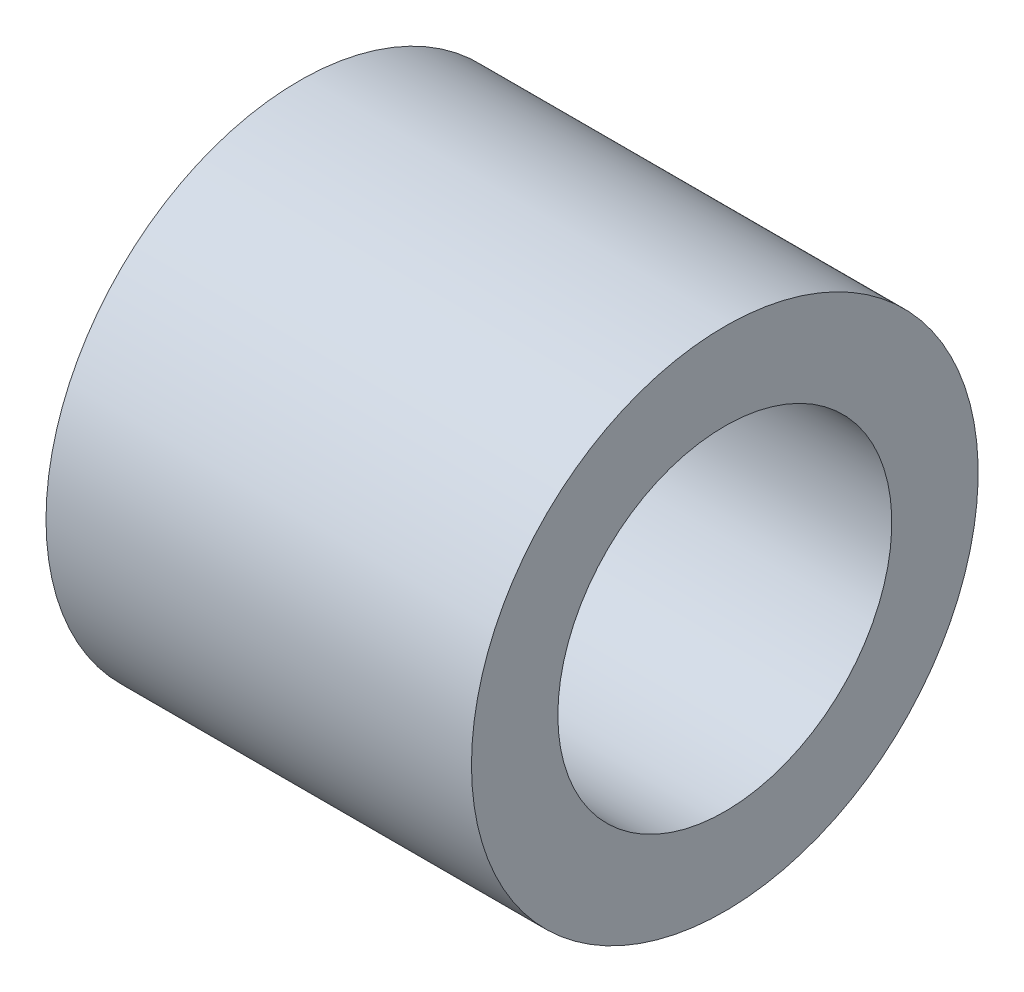
ISO-10303-21;
HEADER;
FILE_DESCRIPTION(('STEP AP214'),'2;1');
FILE_NAME('part.step','',(''),(''),'','','');
FILE_SCHEMA(('AUTOMOTIVE_DESIGN { 1 0 10303 214 1 1 1 1 }'));
ENDSEC;
DATA;
#1=APPLICATION_CONTEXT('core data for automotive mechanical design processes');
#2=APPLICATION_PROTOCOL_DEFINITION('international standard','automotive_design',2000,#1);
#3=PRODUCT_CONTEXT('',#1,'mechanical');
#4=PRODUCT('Part','Part','',(#3));
#5=PRODUCT_RELATED_PRODUCT_CATEGORY('part','',(#4));
#6=PRODUCT_DEFINITION_FORMATION('','',#4);
#7=PRODUCT_DEFINITION_CONTEXT('part definition',#1,'design');
#8=PRODUCT_DEFINITION('design','',#6,#7);
#9=PRODUCT_DEFINITION_SHAPE('','',#8);
#10=(LENGTH_UNIT() NAMED_UNIT(*) SI_UNIT(.MILLI.,.METRE.));
#11=(NAMED_UNIT(*) PLANE_ANGLE_UNIT() SI_UNIT($,.RADIAN.));
#12=(NAMED_UNIT(*) SI_UNIT($,.STERADIAN.) SOLID_ANGLE_UNIT());
#13=UNCERTAINTY_MEASURE_WITH_UNIT(LENGTH_MEASURE(1.E-05),#10,'distance_accuracy_value','');
#14=(GEOMETRIC_REPRESENTATION_CONTEXT(3) GLOBAL_UNCERTAINTY_ASSIGNED_CONTEXT((#13)) GLOBAL_UNIT_ASSIGNED_CONTEXT((#10,
#11,#12)) REPRESENTATION_CONTEXT('',''));
#15=CARTESIAN_POINT('',(0.,0.,0.));
#16=DIRECTION('',(0.,0.,1.));
#17=DIRECTION('',(1.,0.,0.));
#18=AXIS2_PLACEMENT_3D('',#15,#16,#17);
#19=CARTESIAN_POINT('',(7.1374,0.,0.));
#20=DIRECTION('',(-1.,0.,0.));
#21=DIRECTION('',(0.,0.,1.));
#22=AXIS2_PLACEMENT_3D('',#19,#20,#21);
#23=CYLINDRICAL_SURFACE('',#22,5.6019141918931);
#24=CARTESIAN_POINT('',(-7.1374,0.,0.));
#25=DIRECTION('',(-1.,0.,0.));
#26=DIRECTION('',(0.,0.,1.));
#27=AXIS2_PLACEMENT_3D('',#24,#25,#26);
#28=CIRCLE('',#27,5.6019141918931);
#29=CARTESIAN_POINT('',(-7.1374,0.,5.6019141918931));
#30=VERTEX_POINT('',#29);
#31=EDGE_CURVE('E27',#30,#30,#28,.T.);
#32=ORIENTED_EDGE('',*,*,#31,.T.);
#33=EDGE_LOOP('',(#32));
#34=FACE_BOUND('',#33,.T.);
#35=CARTESIAN_POINT('',(7.1374,0.,0.));
#36=DIRECTION('',(-1.,0.,0.));
#37=DIRECTION('',(0.,0.,1.));
#38=AXIS2_PLACEMENT_3D('',#35,#36,#37);
#39=CIRCLE('',#38,5.6019141918931);
#40=CARTESIAN_POINT('',(7.1374,0.,5.6019141918931));
#41=VERTEX_POINT('',#40);
#42=EDGE_CURVE('E18',#41,#41,#39,.T.);
#43=ORIENTED_EDGE('',*,*,#42,.F.);
#44=EDGE_LOOP('',(#43));
#45=FACE_BOUND('',#44,.T.);
#46=ADVANCED_FACE('F15',(#34,#45),#23,.F.);
#47=CARTESIAN_POINT('',(7.1374,0.,0.));
#48=DIRECTION('',(1.,0.,0.));
#49=DIRECTION('',(0.,0.,-1.));
#50=AXIS2_PLACEMENT_3D('',#47,#48,#49);
#51=PLANE('',#50);
#52=ORIENTED_EDGE('',*,*,#42,.T.);
#53=EDGE_LOOP('',(#52));
#54=FACE_BOUND('',#53,.T.);
#55=CARTESIAN_POINT('',(7.1374,0.,0.));
#56=DIRECTION('',(-1.,0.,0.));
#57=DIRECTION('',(0.,0.,1.));
#58=AXIS2_PLACEMENT_3D('',#55,#56,#57);
#59=CIRCLE('',#58,8.5);
#60=CARTESIAN_POINT('',(7.1374,0.,8.5));
#61=VERTEX_POINT('',#60);
#62=EDGE_CURVE('E22',#61,#61,#59,.T.);
#63=ORIENTED_EDGE('',*,*,#62,.F.);
#64=EDGE_LOOP('',(#63));
#65=FACE_BOUND('',#64,.T.);
#66=ADVANCED_FACE('F35',(#54,#65),#51,.T.);
#67=CARTESIAN_POINT('',(-7.1374,0.,0.));
#68=DIRECTION('',(1.,0.,0.));
#69=DIRECTION('',(0.,0.,-1.));
#70=AXIS2_PLACEMENT_3D('',#67,#68,#69);
#71=PLANE('',#70);
#72=ORIENTED_EDGE('',*,*,#31,.F.);
#73=EDGE_LOOP('',(#72));
#74=FACE_BOUND('',#73,.T.);
#75=CARTESIAN_POINT('',(-7.1374,0.,0.));
#76=DIRECTION('',(-1.,0.,0.));
#77=DIRECTION('',(0.,0.,1.));
#78=AXIS2_PLACEMENT_3D('',#75,#76,#77);
#79=CIRCLE('',#78,8.5);
#80=CARTESIAN_POINT('',(-7.1374,0.,8.5));
#81=VERTEX_POINT('',#80);
#82=EDGE_CURVE('E10',#81,#81,#79,.F.);
#83=ORIENTED_EDGE('',*,*,#82,.F.);
#84=EDGE_LOOP('',(#83));
#85=FACE_BOUND('',#84,.T.);
#86=ADVANCED_FACE('F43',(#74,#85),#71,.F.);
#87=CARTESIAN_POINT('',(7.1374,0.,0.));
#88=DIRECTION('',(-1.,0.,0.));
#89=DIRECTION('',(0.,0.,1.));
#90=AXIS2_PLACEMENT_3D('',#87,#88,#89);
#91=CYLINDRICAL_SURFACE('',#90,8.5);
#92=ORIENTED_EDGE('',*,*,#82,.T.);
#93=EDGE_LOOP('',(#92));
#94=FACE_BOUND('',#93,.T.);
#95=ORIENTED_EDGE('',*,*,#62,.T.);
#96=EDGE_LOOP('',(#95));
#97=FACE_BOUND('',#96,.T.);
#98=ADVANCED_FACE('F44',(#94,#97),#91,.T.);
#99=CLOSED_SHELL('',(#46,#66,#86,#98));
#100=MANIFOLD_SOLID_BREP('B1',#99);
#101=ADVANCED_BREP_SHAPE_REPRESENTATION('',(#18,#100),#14);
#102=SHAPE_DEFINITION_REPRESENTATION(#9,#101);
ENDSEC;
END-ISO-10303-21;
